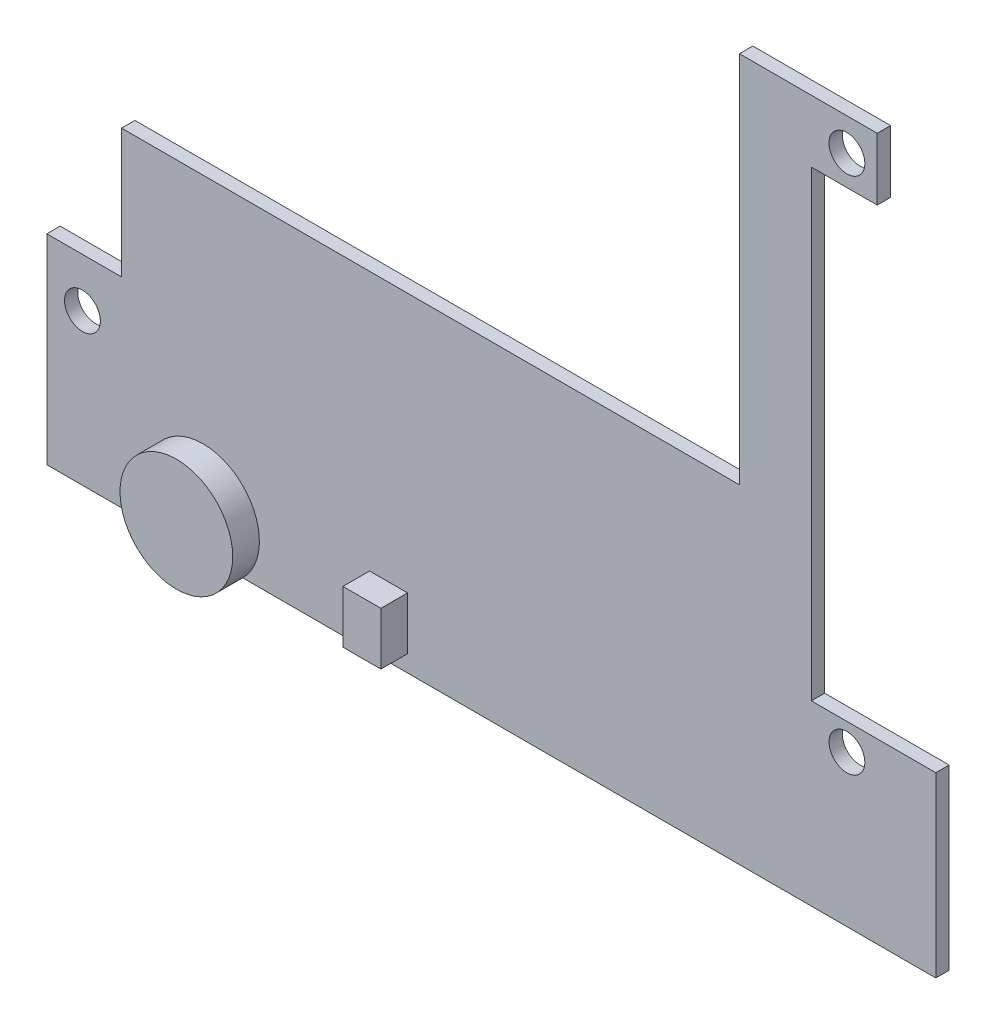
ISO-10303-21;
HEADER;
FILE_DESCRIPTION(('STEP AP214'),'2;1');
FILE_NAME('part.step','',(''),(''),'','','');
FILE_SCHEMA(('AUTOMOTIVE_DESIGN { 1 0 10303 214 1 1 1 1 }'));
ENDSEC;
DATA;
#1=APPLICATION_CONTEXT('core data for automotive mechanical design processes');
#2=APPLICATION_PROTOCOL_DEFINITION('international standard','automotive_design',2000,#1);
#3=PRODUCT_CONTEXT('',#1,'mechanical');
#4=PRODUCT('Part','Part','',(#3));
#5=PRODUCT_RELATED_PRODUCT_CATEGORY('part','',(#4));
#6=PRODUCT_DEFINITION_FORMATION('','',#4);
#7=PRODUCT_DEFINITION_CONTEXT('part definition',#1,'design');
#8=PRODUCT_DEFINITION('design','',#6,#7);
#9=PRODUCT_DEFINITION_SHAPE('','',#8);
#10=(LENGTH_UNIT() NAMED_UNIT(*) SI_UNIT(.MILLI.,.METRE.));
#11=(NAMED_UNIT(*) PLANE_ANGLE_UNIT() SI_UNIT($,.RADIAN.));
#12=(NAMED_UNIT(*) SI_UNIT($,.STERADIAN.) SOLID_ANGLE_UNIT());
#13=UNCERTAINTY_MEASURE_WITH_UNIT(LENGTH_MEASURE(1.E-05),#10,'distance_accuracy_value','');
#14=(GEOMETRIC_REPRESENTATION_CONTEXT(3) GLOBAL_UNCERTAINTY_ASSIGNED_CONTEXT((#13)) GLOBAL_UNIT_ASSIGNED_CONTEXT((#10,
#11,#12)) REPRESENTATION_CONTEXT('',''));
#15=CARTESIAN_POINT('',(0.,0.,0.));
#16=DIRECTION('',(0.,0.,1.));
#17=DIRECTION('',(1.,0.,0.));
#18=AXIS2_PLACEMENT_3D('',#15,#16,#17);
#19=CARTESIAN_POINT('',(0.,0.,1.5));
#20=DIRECTION('',(0.,0.,-1.));
#21=DIRECTION('',(-1.,0.,0.));
#22=AXIS2_PLACEMENT_3D('',#19,#20,#21);
#23=PLANE('',#22);
#24=CARTESIAN_POINT('',(10.0966787159431,35.5254699246634,1.5));
#25=DIRECTION('',(0.,0.,1.));
#26=DIRECTION('',(1.,0.,0.));
#27=AXIS2_PLACEMENT_3D('',#24,#25,#26);
#28=CIRCLE('',#27,2.01464757203241);
#29=CARTESIAN_POINT('',(12.1113262879755,35.5254699246634,1.5));
#30=VERTEX_POINT('',#29);
#31=EDGE_CURVE('E185',#30,#30,#28,.T.);
#32=ORIENTED_EDGE('',*,*,#31,.F.);
#33=EDGE_LOOP('',(#32));
#34=FACE_BOUND('',#33,.T.);
#35=CARTESIAN_POINT('',(96.096678715943,93.8749775468672,1.5));
#36=DIRECTION('',(0.,0.,1.));
#37=DIRECTION('',(1.,0.,0.));
#38=AXIS2_PLACEMENT_3D('',#35,#36,#37);
#39=CIRCLE('',#38,2.01464757203242);
#40=CARTESIAN_POINT('',(98.1113262879755,93.8749775468672,1.5));
#41=VERTEX_POINT('',#40);
#42=EDGE_CURVE('E191',#41,#41,#39,.T.);
#43=ORIENTED_EDGE('',*,*,#42,.F.);
#44=EDGE_LOOP('',(#43));
#45=FACE_BOUND('',#44,.T.);
#46=CARTESIAN_POINT('',(96.096678715943,35.5254699246634,1.5));
#47=DIRECTION('',(0.,0.,1.));
#48=DIRECTION('',(1.,0.,0.));
#49=AXIS2_PLACEMENT_3D('',#46,#47,#48);
#50=CIRCLE('',#49,2.01464757203242);
#51=CARTESIAN_POINT('',(98.1113262879755,35.5254699246634,1.5));
#52=VERTEX_POINT('',#51);
#53=EDGE_CURVE('E197',#52,#52,#50,.T.);
#54=ORIENTED_EDGE('',*,*,#53,.F.);
#55=EDGE_LOOP('',(#54));
#56=FACE_BOUND('',#55,.T.);
#57=CARTESIAN_POINT('',(23.6652387506489,23.0228261901064,1.5));
#58=DIRECTION('',(0.,0.,1.));
#59=DIRECTION('',(1.,0.,0.));
#60=AXIS2_PLACEMENT_3D('',#57,#58,#59);
#61=CIRCLE('',#60,6.33853498187646);
#62=CARTESIAN_POINT('',(28.1318719724562,18.5254699246634,1.5));
#63=VERTEX_POINT('',#62);
#64=CARTESIAN_POINT('',(19.1986055288416,18.5254699246634,1.5));
#65=VERTEX_POINT('',#64);
#66=EDGE_CURVE('E11',#63,#65,#61,.T.);
#67=ORIENTED_EDGE('',*,*,#66,.F.);
#68=DIRECTION('',(1.,0.,0.));
#69=VECTOR('',#68,1.);
#70=CARTESIAN_POINT('',(70.5324951190424,18.5254699246634,1.5));
#71=LINE('',#70,#69);
#72=CARTESIAN_POINT('',(106.096678715943,18.5254699246634,1.5));
#73=VERTEX_POINT('',#72);
#74=EDGE_CURVE('E207',#63,#73,#71,.T.);
#75=ORIENTED_EDGE('',*,*,#74,.T.);
#76=DIRECTION('',(0.,1.,0.));
#77=VECTOR('',#76,1.);
#78=CARTESIAN_POINT('',(106.096678715943,38.5254699246634,1.5));
#79=LINE('',#78,#77);
#80=CARTESIAN_POINT('',(106.096678715943,38.5254699246634,1.5));
#81=VERTEX_POINT('',#80);
#82=EDGE_CURVE('E205',#73,#81,#79,.T.);
#83=ORIENTED_EDGE('',*,*,#82,.T.);
#84=DIRECTION('',(-1.,0.,0.));
#85=VECTOR('',#84,1.);
#86=CARTESIAN_POINT('',(92.0966787159431,38.5254699246634,1.5));
#87=LINE('',#86,#85);
#88=CARTESIAN_POINT('',(92.0966787159431,38.5254699246634,1.5));
#89=VERTEX_POINT('',#88);
#90=EDGE_CURVE('E209',#81,#89,#87,.T.);
#91=ORIENTED_EDGE('',*,*,#90,.T.);
#92=DIRECTION('',(0.,1.,0.));
#93=VECTOR('',#92,1.);
#94=CARTESIAN_POINT('',(92.096678715943,90.5254699246634,1.5));
#95=LINE('',#94,#93);
#96=CARTESIAN_POINT('',(92.096678715943,90.5254699246634,1.5));
#97=VERTEX_POINT('',#96);
#98=EDGE_CURVE('E211',#89,#97,#95,.T.);
#99=ORIENTED_EDGE('',*,*,#98,.T.);
#100=DIRECTION('',(1.,0.,0.));
#101=VECTOR('',#100,1.);
#102=CARTESIAN_POINT('',(99.5047579752899,90.5254699246634,1.5));
#103=LINE('',#102,#101);
#104=CARTESIAN_POINT('',(99.5047579752899,90.5254699246634,1.5));
#105=VERTEX_POINT('',#104);
#106=EDGE_CURVE('E213',#97,#105,#103,.T.);
#107=ORIENTED_EDGE('',*,*,#106,.T.);
#108=DIRECTION('',(0.,1.,0.));
#109=VECTOR('',#108,1.);
#110=CARTESIAN_POINT('',(99.5047579752899,97.5254699246634,1.5));
#111=LINE('',#110,#109);
#112=CARTESIAN_POINT('',(99.5047579752899,97.5254699246634,1.5));
#113=VERTEX_POINT('',#112);
#114=EDGE_CURVE('E215',#105,#113,#111,.T.);
#115=ORIENTED_EDGE('',*,*,#114,.T.);
#116=DIRECTION('',(-1.,0.,0.));
#117=VECTOR('',#116,1.);
#118=CARTESIAN_POINT('',(84.0047579752899,97.5254699246634,1.5));
#119=LINE('',#118,#117);
#120=CARTESIAN_POINT('',(84.0047579752899,97.5254699246634,1.5));
#121=VERTEX_POINT('',#120);
#122=EDGE_CURVE('E217',#113,#121,#119,.T.);
#123=ORIENTED_EDGE('',*,*,#122,.T.);
#124=DIRECTION('',(0.,-1.,0.));
#125=VECTOR('',#124,1.);
#126=CARTESIAN_POINT('',(84.0047579752899,55.5254699246634,1.5));
#127=LINE('',#126,#125);
#128=CARTESIAN_POINT('',(84.0047579752899,55.5254699246634,1.5));
#129=VERTEX_POINT('',#128);
#130=EDGE_CURVE('E219',#121,#129,#127,.T.);
#131=ORIENTED_EDGE('',*,*,#130,.T.);
#132=DIRECTION('',(-1.,0.,0.));
#133=VECTOR('',#132,1.);
#134=CARTESIAN_POINT('',(14.5047579752899,55.5254699246634,1.5));
#135=LINE('',#134,#133);
#136=CARTESIAN_POINT('',(14.5047579752899,55.5254699246634,1.5));
#137=VERTEX_POINT('',#136);
#138=EDGE_CURVE('E221',#129,#137,#135,.T.);
#139=ORIENTED_EDGE('',*,*,#138,.T.);
#140=DIRECTION('',(0.,-1.,0.));
#141=VECTOR('',#140,1.);
#142=CARTESIAN_POINT('',(14.5047579752899,41.0254699246634,1.5));
#143=LINE('',#142,#141);
#144=CARTESIAN_POINT('',(14.5047579752899,41.0254699246634,1.5));
#145=VERTEX_POINT('',#144);
#146=EDGE_CURVE('E223',#137,#145,#143,.T.);
#147=ORIENTED_EDGE('',*,*,#146,.T.);
#148=DIRECTION('',(-1.,0.,0.));
#149=VECTOR('',#148,1.);
#150=CARTESIAN_POINT('',(6.09667871594305,41.0254699246634,1.5));
#151=LINE('',#150,#149);
#152=CARTESIAN_POINT('',(6.09667871594305,41.0254699246634,1.5));
#153=VERTEX_POINT('',#152);
#154=EDGE_CURVE('E225',#145,#153,#151,.T.);
#155=ORIENTED_EDGE('',*,*,#154,.T.);
#156=DIRECTION('',(0.,-1.,0.));
#157=VECTOR('',#156,1.);
#158=CARTESIAN_POINT('',(6.09667871594305,18.5254699246634,1.5));
#159=LINE('',#158,#157);
#160=CARTESIAN_POINT('',(6.09667871594305,18.5254699246634,1.5));
#161=VERTEX_POINT('',#160);
#162=EDGE_CURVE('E227',#153,#161,#159,.T.);
#163=ORIENTED_EDGE('',*,*,#162,.T.);
#164=EDGE_CURVE('E203',#161,#65,#71,.T.);
#165=ORIENTED_EDGE('',*,*,#164,.T.);
#166=EDGE_LOOP('',(#67,#75,#83,#91,#99,#107,#115,#123,#131,#139,#147,#155,#163,#165));
#167=FACE_BOUND('',#166,.T.);
#168=DIRECTION('',(0.,-1.,0.));
#169=VECTOR('',#168,1.);
#170=CARTESIAN_POINT('',(42.4008286174756,26.3291067548405,1.5));
#171=LINE('',#170,#169);
#172=CARTESIAN_POINT('',(42.4008286174756,26.3291067548405,1.5));
#173=VERTEX_POINT('',#172);
#174=CARTESIAN_POINT('',(42.4008286174756,20.4053540763586,1.5));
#175=VERTEX_POINT('',#174);
#176=EDGE_CURVE('E174',#173,#175,#171,.T.);
#177=ORIENTED_EDGE('',*,*,#176,.F.);
#178=DIRECTION('',(-1.,0.,0.));
#179=VECTOR('',#178,1.);
#180=CARTESIAN_POINT('',(42.4008286174756,26.3291067548405,1.5));
#181=LINE('',#180,#179);
#182=CARTESIAN_POINT('',(46.6714410135905,26.3291067548405,1.5));
#183=VERTEX_POINT('',#182);
#184=EDGE_CURVE('E171',#183,#173,#181,.T.);
#185=ORIENTED_EDGE('',*,*,#184,.F.);
#186=DIRECTION('',(0.,1.,0.));
#187=VECTOR('',#186,1.);
#188=CARTESIAN_POINT('',(46.6714410135905,26.3291067548405,1.5));
#189=LINE('',#188,#187);
#190=CARTESIAN_POINT('',(46.6714410135905,20.4053540763586,1.5));
#191=VERTEX_POINT('',#190);
#192=EDGE_CURVE('E55',#191,#183,#189,.T.);
#193=ORIENTED_EDGE('',*,*,#192,.F.);
#194=DIRECTION('',(1.,0.,0.));
#195=VECTOR('',#194,1.);
#196=CARTESIAN_POINT('',(42.4008286174756,20.4053540763586,1.5));
#197=LINE('',#196,#195);
#198=EDGE_CURVE('E50',#175,#191,#197,.T.);
#199=ORIENTED_EDGE('',*,*,#198,.F.);
#200=EDGE_LOOP('',(#177,#185,#193,#199));
#201=FACE_BOUND('',#200,.T.);
#202=ADVANCED_FACE('F33',(#34,#45,#56,#167,#201),#23,.F.);
#203=CARTESIAN_POINT('',(0.,0.,0.));
#204=DIRECTION('',(0.,0.,-1.));
#205=DIRECTION('',(-1.,0.,0.));
#206=AXIS2_PLACEMENT_3D('',#203,#204,#205);
#207=PLANE('',#206);
#208=CARTESIAN_POINT('',(96.096678715943,93.8749775468672,0.));
#209=DIRECTION('',(0.,0.,1.));
#210=DIRECTION('',(1.,0.,0.));
#211=AXIS2_PLACEMENT_3D('',#208,#209,#210);
#212=CIRCLE('',#211,2.01464757203242);
#213=CARTESIAN_POINT('',(98.1113262879755,93.8749775468672,0.));
#214=VERTEX_POINT('',#213);
#215=EDGE_CURVE('E188',#214,#214,#212,.T.);
#216=ORIENTED_EDGE('',*,*,#215,.T.);
#217=EDGE_LOOP('',(#216));
#218=FACE_BOUND('',#217,.T.);
#219=DIRECTION('',(1.,0.,0.));
#220=VECTOR('',#219,1.);
#221=CARTESIAN_POINT('',(106.096678715943,18.5254699246634,0.));
#222=LINE('',#221,#220);
#223=CARTESIAN_POINT('',(6.09667871594305,18.5254699246634,0.));
#224=VERTEX_POINT('',#223);
#225=CARTESIAN_POINT('',(106.096678715943,18.5254699246634,0.));
#226=VERTEX_POINT('',#225);
#227=EDGE_CURVE('E200',#224,#226,#222,.T.);
#228=ORIENTED_EDGE('',*,*,#227,.F.);
#229=DIRECTION('',(0.,-1.,0.));
#230=VECTOR('',#229,1.);
#231=CARTESIAN_POINT('',(6.09667871594305,18.5254699246634,0.));
#232=LINE('',#231,#230);
#233=CARTESIAN_POINT('',(6.09667871594305,41.0254699246634,0.));
#234=VERTEX_POINT('',#233);
#235=EDGE_CURVE('E251',#234,#224,#232,.T.);
#236=ORIENTED_EDGE('',*,*,#235,.F.);
#237=DIRECTION('',(-1.,0.,0.));
#238=VECTOR('',#237,1.);
#239=CARTESIAN_POINT('',(6.09667871594305,41.0254699246634,0.));
#240=LINE('',#239,#238);
#241=CARTESIAN_POINT('',(14.5047579752899,41.0254699246634,0.));
#242=VERTEX_POINT('',#241);
#243=EDGE_CURVE('E249',#242,#234,#240,.T.);
#244=ORIENTED_EDGE('',*,*,#243,.F.);
#245=DIRECTION('',(0.,-1.,0.));
#246=VECTOR('',#245,1.);
#247=CARTESIAN_POINT('',(14.5047579752899,41.0254699246634,0.));
#248=LINE('',#247,#246);
#249=CARTESIAN_POINT('',(14.5047579752899,55.5254699246634,0.));
#250=VERTEX_POINT('',#249);
#251=EDGE_CURVE('E247',#250,#242,#248,.T.);
#252=ORIENTED_EDGE('',*,*,#251,.F.);
#253=DIRECTION('',(-1.,0.,0.));
#254=VECTOR('',#253,1.);
#255=CARTESIAN_POINT('',(14.5047579752899,55.5254699246634,0.));
#256=LINE('',#255,#254);
#257=CARTESIAN_POINT('',(84.0047579752899,55.5254699246634,0.));
#258=VERTEX_POINT('',#257);
#259=EDGE_CURVE('E245',#258,#250,#256,.T.);
#260=ORIENTED_EDGE('',*,*,#259,.F.);
#261=DIRECTION('',(0.,-1.,0.));
#262=VECTOR('',#261,1.);
#263=CARTESIAN_POINT('',(84.0047579752899,55.5254699246634,0.));
#264=LINE('',#263,#262);
#265=CARTESIAN_POINT('',(84.0047579752899,97.5254699246634,0.));
#266=VERTEX_POINT('',#265);
#267=EDGE_CURVE('E243',#266,#258,#264,.T.);
#268=ORIENTED_EDGE('',*,*,#267,.F.);
#269=DIRECTION('',(-1.,0.,0.));
#270=VECTOR('',#269,1.);
#271=CARTESIAN_POINT('',(84.0047579752899,97.5254699246634,0.));
#272=LINE('',#271,#270);
#273=CARTESIAN_POINT('',(99.5047579752899,97.5254699246634,0.));
#274=VERTEX_POINT('',#273);
#275=EDGE_CURVE('E241',#274,#266,#272,.T.);
#276=ORIENTED_EDGE('',*,*,#275,.F.);
#277=DIRECTION('',(0.,1.,0.));
#278=VECTOR('',#277,1.);
#279=CARTESIAN_POINT('',(99.5047579752899,97.5254699246634,0.));
#280=LINE('',#279,#278);
#281=CARTESIAN_POINT('',(99.5047579752899,90.5254699246634,0.));
#282=VERTEX_POINT('',#281);
#283=EDGE_CURVE('E239',#282,#274,#280,.T.);
#284=ORIENTED_EDGE('',*,*,#283,.F.);
#285=DIRECTION('',(1.,0.,0.));
#286=VECTOR('',#285,1.);
#287=CARTESIAN_POINT('',(99.5047579752899,90.5254699246634,0.));
#288=LINE('',#287,#286);
#289=CARTESIAN_POINT('',(92.096678715943,90.5254699246634,0.));
#290=VERTEX_POINT('',#289);
#291=EDGE_CURVE('E237',#290,#282,#288,.T.);
#292=ORIENTED_EDGE('',*,*,#291,.F.);
#293=DIRECTION('',(0.,1.,0.));
#294=VECTOR('',#293,1.);
#295=CARTESIAN_POINT('',(92.096678715943,90.5254699246634,0.));
#296=LINE('',#295,#294);
#297=CARTESIAN_POINT('',(92.0966787159431,38.5254699246634,0.));
#298=VERTEX_POINT('',#297);
#299=EDGE_CURVE('E235',#298,#290,#296,.T.);
#300=ORIENTED_EDGE('',*,*,#299,.F.);
#301=DIRECTION('',(-1.,0.,0.));
#302=VECTOR('',#301,1.);
#303=CARTESIAN_POINT('',(92.0966787159431,38.5254699246634,0.));
#304=LINE('',#303,#302);
#305=CARTESIAN_POINT('',(106.096678715943,38.5254699246634,0.));
#306=VERTEX_POINT('',#305);
#307=EDGE_CURVE('E233',#306,#298,#304,.T.);
#308=ORIENTED_EDGE('',*,*,#307,.F.);
#309=DIRECTION('',(0.,1.,0.));
#310=VECTOR('',#309,1.);
#311=CARTESIAN_POINT('',(106.096678715943,38.5254699246634,0.));
#312=LINE('',#311,#310);
#313=EDGE_CURVE('E231',#226,#306,#312,.T.);
#314=ORIENTED_EDGE('',*,*,#313,.F.);
#315=EDGE_LOOP('',(#228,#236,#244,#252,#260,#268,#276,#284,#292,#300,#308,#314));
#316=FACE_BOUND('',#315,.T.);
#317=CARTESIAN_POINT('',(96.096678715943,35.5254699246634,0.));
#318=DIRECTION('',(0.,0.,1.));
#319=DIRECTION('',(1.,0.,0.));
#320=AXIS2_PLACEMENT_3D('',#317,#318,#319);
#321=CIRCLE('',#320,2.01464757203242);
#322=CARTESIAN_POINT('',(98.1113262879755,35.5254699246634,0.));
#323=VERTEX_POINT('',#322);
#324=EDGE_CURVE('E194',#323,#323,#321,.T.);
#325=ORIENTED_EDGE('',*,*,#324,.T.);
#326=EDGE_LOOP('',(#325));
#327=FACE_BOUND('',#326,.T.);
#328=CARTESIAN_POINT('',(10.0966787159431,35.5254699246634,0.));
#329=DIRECTION('',(0.,0.,1.));
#330=DIRECTION('',(1.,0.,0.));
#331=AXIS2_PLACEMENT_3D('',#328,#329,#330);
#332=CIRCLE('',#331,2.01464757203241);
#333=CARTESIAN_POINT('',(12.1113262879755,35.5254699246634,0.));
#334=VERTEX_POINT('',#333);
#335=EDGE_CURVE('E183',#334,#334,#332,.T.);
#336=ORIENTED_EDGE('',*,*,#335,.T.);
#337=EDGE_LOOP('',(#336));
#338=FACE_BOUND('',#337,.T.);
#339=ADVANCED_FACE('F297',(#218,#316,#327,#338),#207,.T.);
#340=CARTESIAN_POINT('',(106.096678715943,18.5254699246634,1.5));
#341=DIRECTION('',(0.,1.,0.));
#342=DIRECTION('',(-1.,0.,0.));
#343=AXIS2_PLACEMENT_3D('',#340,#341,#342);
#344=PLANE('',#343);
#345=ORIENTED_EDGE('',*,*,#227,.T.);
#346=DIRECTION('',(0.,0.,-1.));
#347=VECTOR('',#346,1.);
#348=CARTESIAN_POINT('',(106.096678715943,18.5254699246634,1.5));
#349=LINE('',#348,#347);
#350=EDGE_CURVE('E37',#73,#226,#349,.T.);
#351=ORIENTED_EDGE('',*,*,#350,.F.);
#352=ORIENTED_EDGE('',*,*,#74,.F.);
#353=EDGE_CURVE('E206',#65,#63,#71,.T.);
#354=ORIENTED_EDGE('',*,*,#353,.F.);
#355=ORIENTED_EDGE('',*,*,#164,.F.);
#356=DIRECTION('',(0.,0.,-1.));
#357=VECTOR('',#356,1.);
#358=CARTESIAN_POINT('',(6.09667871594305,18.5254699246634,1.5));
#359=LINE('',#358,#357);
#360=EDGE_CURVE('E229',#161,#224,#359,.T.);
#361=ORIENTED_EDGE('',*,*,#360,.T.);
#362=EDGE_LOOP('',(#345,#351,#352,#354,#355,#361));
#363=FACE_BOUND('',#362,.T.);
#364=ADVANCED_FACE('F35',(#363),#344,.F.);
#365=CARTESIAN_POINT('',(106.096678715943,38.5254699246634,1.5));
#366=DIRECTION('',(-1.,0.,0.));
#367=DIRECTION('',(0.,0.,1.));
#368=AXIS2_PLACEMENT_3D('',#365,#366,#367);
#369=PLANE('',#368);
#370=ORIENTED_EDGE('',*,*,#313,.T.);
#371=DIRECTION('',(0.,0.,-1.));
#372=VECTOR('',#371,1.);
#373=CARTESIAN_POINT('',(106.096678715943,38.5254699246634,1.5));
#374=LINE('',#373,#372);
#375=EDGE_CURVE('E282',#81,#306,#374,.T.);
#376=ORIENTED_EDGE('',*,*,#375,.F.);
#377=ORIENTED_EDGE('',*,*,#82,.F.);
#378=ORIENTED_EDGE('',*,*,#350,.T.);
#379=EDGE_LOOP('',(#370,#376,#377,#378));
#380=FACE_BOUND('',#379,.T.);
#381=ADVANCED_FACE('F293',(#380),#369,.F.);
#382=CARTESIAN_POINT('',(92.0966787159431,38.5254699246634,1.5));
#383=DIRECTION('',(0.,-1.,0.));
#384=DIRECTION('',(1.,0.,0.));
#385=AXIS2_PLACEMENT_3D('',#382,#383,#384);
#386=PLANE('',#385);
#387=ORIENTED_EDGE('',*,*,#307,.T.);
#388=DIRECTION('',(0.,0.,-1.));
#389=VECTOR('',#388,1.);
#390=CARTESIAN_POINT('',(92.0966787159431,38.5254699246634,1.5));
#391=LINE('',#390,#389);
#392=EDGE_CURVE('E280',#89,#298,#391,.T.);
#393=ORIENTED_EDGE('',*,*,#392,.F.);
#394=ORIENTED_EDGE('',*,*,#90,.F.);
#395=ORIENTED_EDGE('',*,*,#375,.T.);
#396=EDGE_LOOP('',(#387,#393,#394,#395));
#397=FACE_BOUND('',#396,.T.);
#398=ADVANCED_FACE('F303',(#397),#386,.F.);
#399=CARTESIAN_POINT('',(92.096678715943,90.5254699246634,1.5));
#400=DIRECTION('',(-1.,0.,0.));
#401=DIRECTION('',(0.,-1.,0.));
#402=AXIS2_PLACEMENT_3D('',#399,#400,#401);
#403=PLANE('',#402);
#404=ORIENTED_EDGE('',*,*,#299,.T.);
#405=DIRECTION('',(0.,0.,-1.));
#406=VECTOR('',#405,1.);
#407=CARTESIAN_POINT('',(92.096678715943,90.5254699246634,1.5));
#408=LINE('',#407,#406);
#409=EDGE_CURVE('E277',#97,#290,#408,.T.);
#410=ORIENTED_EDGE('',*,*,#409,.F.);
#411=ORIENTED_EDGE('',*,*,#98,.F.);
#412=ORIENTED_EDGE('',*,*,#392,.T.);
#413=EDGE_LOOP('',(#404,#410,#411,#412));
#414=FACE_BOUND('',#413,.T.);
#415=ADVANCED_FACE('F306',(#414),#403,.F.);
#416=CARTESIAN_POINT('',(99.5047579752899,90.5254699246634,1.5));
#417=DIRECTION('',(0.,1.,0.));
#418=DIRECTION('',(0.,0.,1.));
#419=AXIS2_PLACEMENT_3D('',#416,#417,#418);
#420=PLANE('',#419);
#421=ORIENTED_EDGE('',*,*,#291,.T.);
#422=DIRECTION('',(0.,0.,-1.));
#423=VECTOR('',#422,1.);
#424=CARTESIAN_POINT('',(99.5047579752899,90.5254699246634,1.5));
#425=LINE('',#424,#423);
#426=EDGE_CURVE('E274',#105,#282,#425,.T.);
#427=ORIENTED_EDGE('',*,*,#426,.F.);
#428=ORIENTED_EDGE('',*,*,#106,.F.);
#429=ORIENTED_EDGE('',*,*,#409,.T.);
#430=EDGE_LOOP('',(#421,#427,#428,#429));
#431=FACE_BOUND('',#430,.T.);
#432=ADVANCED_FACE('F374',(#431),#420,.F.);
#433=CARTESIAN_POINT('',(99.5047579752899,97.5254699246634,1.5));
#434=DIRECTION('',(-1.,0.,0.));
#435=DIRECTION('',(0.,0.,1.));
#436=AXIS2_PLACEMENT_3D('',#433,#434,#435);
#437=PLANE('',#436);
#438=ORIENTED_EDGE('',*,*,#283,.T.);
#439=DIRECTION('',(0.,0.,-1.));
#440=VECTOR('',#439,1.);
#441=CARTESIAN_POINT('',(99.5047579752899,97.5254699246634,1.5));
#442=LINE('',#441,#440);
#443=EDGE_CURVE('E271',#113,#274,#442,.T.);
#444=ORIENTED_EDGE('',*,*,#443,.F.);
#445=ORIENTED_EDGE('',*,*,#114,.F.);
#446=ORIENTED_EDGE('',*,*,#426,.T.);
#447=EDGE_LOOP('',(#438,#444,#445,#446));
#448=FACE_BOUND('',#447,.T.);
#449=ADVANCED_FACE('F370',(#448),#437,.F.);
#450=CARTESIAN_POINT('',(84.0047579752899,97.5254699246634,1.5));
#451=DIRECTION('',(0.,-1.,0.));
#452=DIRECTION('',(0.,0.,-1.));
#453=AXIS2_PLACEMENT_3D('',#450,#451,#452);
#454=PLANE('',#453);
#455=ORIENTED_EDGE('',*,*,#275,.T.);
#456=DIRECTION('',(0.,0.,-1.));
#457=VECTOR('',#456,1.);
#458=CARTESIAN_POINT('',(84.0047579752899,97.5254699246634,1.5));
#459=LINE('',#458,#457);
#460=EDGE_CURVE('E268',#121,#266,#459,.T.);
#461=ORIENTED_EDGE('',*,*,#460,.F.);
#462=ORIENTED_EDGE('',*,*,#122,.F.);
#463=ORIENTED_EDGE('',*,*,#443,.T.);
#464=EDGE_LOOP('',(#455,#461,#462,#463));
#465=FACE_BOUND('',#464,.T.);
#466=ADVANCED_FACE('F366',(#465),#454,.F.);
#467=CARTESIAN_POINT('',(84.0047579752899,55.5254699246634,1.5));
#468=DIRECTION('',(1.,0.,0.));
#469=DIRECTION('',(0.,0.,-1.));
#470=AXIS2_PLACEMENT_3D('',#467,#468,#469);
#471=PLANE('',#470);
#472=ORIENTED_EDGE('',*,*,#267,.T.);
#473=DIRECTION('',(0.,0.,-1.));
#474=VECTOR('',#473,1.);
#475=CARTESIAN_POINT('',(84.0047579752899,55.5254699246634,1.5));
#476=LINE('',#475,#474);
#477=EDGE_CURVE('E265',#129,#258,#476,.T.);
#478=ORIENTED_EDGE('',*,*,#477,.F.);
#479=ORIENTED_EDGE('',*,*,#130,.F.);
#480=ORIENTED_EDGE('',*,*,#460,.T.);
#481=EDGE_LOOP('',(#472,#478,#479,#480));
#482=FACE_BOUND('',#481,.T.);
#483=ADVANCED_FACE('F362',(#482),#471,.F.);
#484=CARTESIAN_POINT('',(14.5047579752899,55.5254699246634,1.5));
#485=DIRECTION('',(0.,-1.,0.));
#486=DIRECTION('',(1.,0.,0.));
#487=AXIS2_PLACEMENT_3D('',#484,#485,#486);
#488=PLANE('',#487);
#489=ORIENTED_EDGE('',*,*,#259,.T.);
#490=DIRECTION('',(0.,0.,-1.));
#491=VECTOR('',#490,1.);
#492=CARTESIAN_POINT('',(14.5047579752899,55.5254699246634,1.5));
#493=LINE('',#492,#491);
#494=EDGE_CURVE('E262',#137,#250,#493,.T.);
#495=ORIENTED_EDGE('',*,*,#494,.F.);
#496=ORIENTED_EDGE('',*,*,#138,.F.);
#497=ORIENTED_EDGE('',*,*,#477,.T.);
#498=EDGE_LOOP('',(#489,#495,#496,#497));
#499=FACE_BOUND('',#498,.T.);
#500=ADVANCED_FACE('F358',(#499),#488,.F.);
#501=CARTESIAN_POINT('',(14.5047579752899,41.0254699246634,1.5));
#502=DIRECTION('',(1.,0.,0.));
#503=DIRECTION('',(0.,0.,-1.));
#504=AXIS2_PLACEMENT_3D('',#501,#502,#503);
#505=PLANE('',#504);
#506=ORIENTED_EDGE('',*,*,#251,.T.);
#507=DIRECTION('',(0.,0.,-1.));
#508=VECTOR('',#507,1.);
#509=CARTESIAN_POINT('',(14.5047579752899,41.0254699246634,1.5));
#510=LINE('',#509,#508);
#511=EDGE_CURVE('E259',#145,#242,#510,.T.);
#512=ORIENTED_EDGE('',*,*,#511,.F.);
#513=ORIENTED_EDGE('',*,*,#146,.F.);
#514=ORIENTED_EDGE('',*,*,#494,.T.);
#515=EDGE_LOOP('',(#506,#512,#513,#514));
#516=FACE_BOUND('',#515,.T.);
#517=ADVANCED_FACE('F354',(#516),#505,.F.);
#518=CARTESIAN_POINT('',(6.09667871594305,41.0254699246634,1.5));
#519=DIRECTION('',(0.,-1.,0.));
#520=DIRECTION('',(1.,0.,0.));
#521=AXIS2_PLACEMENT_3D('',#518,#519,#520);
#522=PLANE('',#521);
#523=ORIENTED_EDGE('',*,*,#243,.T.);
#524=DIRECTION('',(0.,0.,-1.));
#525=VECTOR('',#524,1.);
#526=CARTESIAN_POINT('',(6.09667871594305,41.0254699246634,1.5));
#527=LINE('',#526,#525);
#528=EDGE_CURVE('E256',#153,#234,#527,.T.);
#529=ORIENTED_EDGE('',*,*,#528,.F.);
#530=ORIENTED_EDGE('',*,*,#154,.F.);
#531=ORIENTED_EDGE('',*,*,#511,.T.);
#532=EDGE_LOOP('',(#523,#529,#530,#531));
#533=FACE_BOUND('',#532,.T.);
#534=ADVANCED_FACE('F350',(#533),#522,.F.);
#535=CARTESIAN_POINT('',(6.09667871594305,18.5254699246634,1.5));
#536=DIRECTION('',(1.,0.,0.));
#537=DIRECTION('',(0.,1.,0.));
#538=AXIS2_PLACEMENT_3D('',#535,#536,#537);
#539=PLANE('',#538);
#540=ORIENTED_EDGE('',*,*,#235,.T.);
#541=ORIENTED_EDGE('',*,*,#360,.F.);
#542=ORIENTED_EDGE('',*,*,#162,.F.);
#543=ORIENTED_EDGE('',*,*,#528,.T.);
#544=EDGE_LOOP('',(#540,#541,#542,#543));
#545=FACE_BOUND('',#544,.T.);
#546=ADVANCED_FACE('F347',(#545),#539,.F.);
#547=CARTESIAN_POINT('',(96.096678715943,35.5254699246634,1.5));
#548=DIRECTION('',(0.,0.,-1.));
#549=DIRECTION('',(-1.,0.,0.));
#550=AXIS2_PLACEMENT_3D('',#547,#548,#549);
#551=CYLINDRICAL_SURFACE('',#550,2.01464757203242);
#552=ORIENTED_EDGE('',*,*,#53,.T.);
#553=EDGE_LOOP('',(#552));
#554=FACE_BOUND('',#553,.T.);
#555=ORIENTED_EDGE('',*,*,#324,.F.);
#556=EDGE_LOOP('',(#555));
#557=FACE_BOUND('',#556,.T.);
#558=ADVANCED_FACE('F344',(#554,#557),#551,.F.);
#559=CARTESIAN_POINT('',(96.096678715943,93.8749775468672,1.5));
#560=DIRECTION('',(0.,0.,-1.));
#561=DIRECTION('',(-1.,0.,0.));
#562=AXIS2_PLACEMENT_3D('',#559,#560,#561);
#563=CYLINDRICAL_SURFACE('',#562,2.01464757203242);
#564=ORIENTED_EDGE('',*,*,#42,.T.);
#565=EDGE_LOOP('',(#564));
#566=FACE_BOUND('',#565,.T.);
#567=ORIENTED_EDGE('',*,*,#215,.F.);
#568=EDGE_LOOP('',(#567));
#569=FACE_BOUND('',#568,.T.);
#570=ADVANCED_FACE('F487',(#566,#569),#563,.F.);
#571=CARTESIAN_POINT('',(10.0966787159431,35.5254699246634,1.5));
#572=DIRECTION('',(0.,0.,-1.));
#573=DIRECTION('',(-1.,0.,0.));
#574=AXIS2_PLACEMENT_3D('',#571,#572,#573);
#575=CYLINDRICAL_SURFACE('',#574,2.01464757203241);
#576=ORIENTED_EDGE('',*,*,#31,.T.);
#577=EDGE_LOOP('',(#576));
#578=FACE_BOUND('',#577,.T.);
#579=ORIENTED_EDGE('',*,*,#335,.F.);
#580=EDGE_LOOP('',(#579));
#581=FACE_BOUND('',#580,.T.);
#582=ADVANCED_FACE('F329',(#578,#581),#575,.F.);
#583=CARTESIAN_POINT('',(23.6652387506489,23.0228261901064,1.5));
#584=DIRECTION('',(0.,0.,1.));
#585=DIRECTION('',(1.,0.,0.));
#586=AXIS2_PLACEMENT_3D('',#583,#584,#585);
#587=PLANE('',#586);
#588=EDGE_CURVE('E43',#65,#63,#61,.T.);
#589=ORIENTED_EDGE('',*,*,#588,.F.);
#590=ORIENTED_EDGE('',*,*,#353,.T.);
#591=EDGE_LOOP('',(#589,#590));
#592=FACE_BOUND('',#591,.T.);
#593=ADVANCED_FACE('F315',(#592),#587,.F.);
#594=CARTESIAN_POINT('',(23.6652387506489,23.0228261901064,4.5));
#595=DIRECTION('',(0.,0.,-1.));
#596=DIRECTION('',(-1.,0.,0.));
#597=AXIS2_PLACEMENT_3D('',#594,#595,#596);
#598=CYLINDRICAL_SURFACE('',#597,6.33853498187646);
#599=CARTESIAN_POINT('',(23.6652387506489,23.0228261901064,4.5));
#600=DIRECTION('',(0.,0.,1.));
#601=DIRECTION('',(1.,0.,0.));
#602=AXIS2_PLACEMENT_3D('',#599,#600,#601);
#603=CIRCLE('',#602,6.33853498187646);
#604=CARTESIAN_POINT('',(30.0037737325253,23.0228261901064,4.5));
#605=VERTEX_POINT('',#604);
#606=EDGE_CURVE('E177',#605,#605,#603,.T.);
#607=ORIENTED_EDGE('',*,*,#606,.F.);
#608=EDGE_LOOP('',(#607));
#609=FACE_BOUND('',#608,.T.);
#610=ORIENTED_EDGE('',*,*,#588,.T.);
#611=ORIENTED_EDGE('',*,*,#66,.T.);
#612=EDGE_LOOP('',(#610,#611));
#613=FACE_BOUND('',#612,.T.);
#614=ADVANCED_FACE('F318',(#609,#613),#598,.T.);
#615=CARTESIAN_POINT('',(23.6652387506489,23.0228261901064,4.5));
#616=DIRECTION('',(0.,0.,1.));
#617=DIRECTION('',(1.,0.,0.));
#618=AXIS2_PLACEMENT_3D('',#615,#616,#617);
#619=PLANE('',#618);
#620=ORIENTED_EDGE('',*,*,#606,.T.);
#621=EDGE_LOOP('',(#620));
#622=FACE_BOUND('',#621,.T.);
#623=ADVANCED_FACE('F320',(#622),#619,.T.);
#624=CARTESIAN_POINT('',(42.4008286174756,26.3291067548405,4.5));
#625=DIRECTION('',(1.,0.,0.));
#626=DIRECTION('',(0.,0.,-1.));
#627=AXIS2_PLACEMENT_3D('',#624,#625,#626);
#628=PLANE('',#627);
#629=ORIENTED_EDGE('',*,*,#176,.T.);
#630=DIRECTION('',(0.,0.,-1.));
#631=VECTOR('',#630,1.);
#632=CARTESIAN_POINT('',(42.4008286174756,20.4053540763586,4.5));
#633=LINE('',#632,#631);
#634=CARTESIAN_POINT('',(42.4008286174756,20.4053540763586,4.5));
#635=VERTEX_POINT('',#634);
#636=EDGE_CURVE('E155',#635,#175,#633,.T.);
#637=ORIENTED_EDGE('',*,*,#636,.F.);
#638=DIRECTION('',(0.,-1.,0.));
#639=VECTOR('',#638,1.);
#640=CARTESIAN_POINT('',(42.4008286174756,26.3291067548405,4.5));
#641=LINE('',#640,#639);
#642=CARTESIAN_POINT('',(42.4008286174756,26.3291067548405,4.5));
#643=VERTEX_POINT('',#642);
#644=EDGE_CURVE('E162',#643,#635,#641,.T.);
#645=ORIENTED_EDGE('',*,*,#644,.F.);
#646=DIRECTION('',(0.,0.,-1.));
#647=VECTOR('',#646,1.);
#648=CARTESIAN_POINT('',(42.4008286174756,26.3291067548405,4.5));
#649=LINE('',#648,#647);
#650=EDGE_CURVE('E571',#643,#173,#649,.T.);
#651=ORIENTED_EDGE('',*,*,#650,.T.);
#652=EDGE_LOOP('',(#629,#637,#645,#651));
#653=FACE_BOUND('',#652,.T.);
#654=ADVANCED_FACE('F173',(#653),#628,.F.);
#655=CARTESIAN_POINT('',(42.4008286174756,20.4053540763586,4.5));
#656=DIRECTION('',(0.,1.,0.));
#657=DIRECTION('',(0.,0.,1.));
#658=AXIS2_PLACEMENT_3D('',#655,#656,#657);
#659=PLANE('',#658);
#660=ORIENTED_EDGE('',*,*,#198,.T.);
#661=DIRECTION('',(0.,0.,-1.));
#662=VECTOR('',#661,1.);
#663=CARTESIAN_POINT('',(46.6714410135905,20.4053540763586,4.5));
#664=LINE('',#663,#662);
#665=CARTESIAN_POINT('',(46.6714410135905,20.4053540763586,4.5));
#666=VERTEX_POINT('',#665);
#667=EDGE_CURVE('E158',#666,#191,#664,.T.);
#668=ORIENTED_EDGE('',*,*,#667,.F.);
#669=DIRECTION('',(1.,0.,0.));
#670=VECTOR('',#669,1.);
#671=CARTESIAN_POINT('',(42.4008286174756,20.4053540763586,4.5));
#672=LINE('',#671,#670);
#673=EDGE_CURVE('E151',#635,#666,#672,.T.);
#674=ORIENTED_EDGE('',*,*,#673,.F.);
#675=ORIENTED_EDGE('',*,*,#636,.T.);
#676=EDGE_LOOP('',(#660,#668,#674,#675));
#677=FACE_BOUND('',#676,.T.);
#678=ADVANCED_FACE('F153',(#677),#659,.F.);
#679=CARTESIAN_POINT('',(46.6714410135905,26.3291067548405,4.5));
#680=DIRECTION('',(-1.,0.,0.));
#681=DIRECTION('',(0.,0.,1.));
#682=AXIS2_PLACEMENT_3D('',#679,#680,#681);
#683=PLANE('',#682);
#684=ORIENTED_EDGE('',*,*,#192,.T.);
#685=DIRECTION('',(0.,0.,-1.));
#686=VECTOR('',#685,1.);
#687=CARTESIAN_POINT('',(46.6714410135905,26.3291067548405,4.5));
#688=LINE('',#687,#686);
#689=CARTESIAN_POINT('',(46.6714410135905,26.3291067548405,4.5));
#690=VERTEX_POINT('',#689);
#691=EDGE_CURVE('E178',#690,#183,#688,.T.);
#692=ORIENTED_EDGE('',*,*,#691,.F.);
#693=DIRECTION('',(0.,1.,0.));
#694=VECTOR('',#693,1.);
#695=CARTESIAN_POINT('',(46.6714410135905,26.3291067548405,4.5));
#696=LINE('',#695,#694);
#697=EDGE_CURVE('E161',#666,#690,#696,.T.);
#698=ORIENTED_EDGE('',*,*,#697,.F.);
#699=ORIENTED_EDGE('',*,*,#667,.T.);
#700=EDGE_LOOP('',(#684,#692,#698,#699));
#701=FACE_BOUND('',#700,.T.);
#702=ADVANCED_FACE('F537',(#701),#683,.F.);
#703=CARTESIAN_POINT('',(42.4008286174756,26.3291067548405,4.5));
#704=DIRECTION('',(0.,-1.,0.));
#705=DIRECTION('',(0.,0.,-1.));
#706=AXIS2_PLACEMENT_3D('',#703,#704,#705);
#707=PLANE('',#706);
#708=ORIENTED_EDGE('',*,*,#184,.T.);
#709=ORIENTED_EDGE('',*,*,#650,.F.);
#710=DIRECTION('',(-1.,0.,0.));
#711=VECTOR('',#710,1.);
#712=CARTESIAN_POINT('',(42.4008286174756,26.3291067548405,4.5));
#713=LINE('',#712,#711);
#714=EDGE_CURVE('E167',#690,#643,#713,.T.);
#715=ORIENTED_EDGE('',*,*,#714,.F.);
#716=ORIENTED_EDGE('',*,*,#691,.T.);
#717=EDGE_LOOP('',(#708,#709,#715,#716));
#718=FACE_BOUND('',#717,.T.);
#719=ADVANCED_FACE('F545',(#718),#707,.F.);
#720=CARTESIAN_POINT('',(0.,0.,4.5));
#721=DIRECTION('',(0.,0.,1.));
#722=DIRECTION('',(1.,0.,0.));
#723=AXIS2_PLACEMENT_3D('',#720,#721,#722);
#724=PLANE('',#723);
#725=ORIENTED_EDGE('',*,*,#644,.T.);
#726=ORIENTED_EDGE('',*,*,#673,.T.);
#727=ORIENTED_EDGE('',*,*,#697,.T.);
#728=ORIENTED_EDGE('',*,*,#714,.T.);
#729=EDGE_LOOP('',(#725,#726,#727,#728));
#730=FACE_BOUND('',#729,.T.);
#731=ADVANCED_FACE('F165',(#730),#724,.T.);
#732=CLOSED_SHELL('',(#202,#339,#364,#381,#398,#415,#432,#449,#466,#483,#500,#517,#534,#546,
#558,#570,#582,#593,#614,#623,#654,#678,#702,#719,#731));
#733=MANIFOLD_SOLID_BREP('B2',#732);
#734=ADVANCED_BREP_SHAPE_REPRESENTATION('',(#18,#733),#14);
#735=SHAPE_DEFINITION_REPRESENTATION(#9,#734);
ENDSEC;
END-ISO-10303-21;
